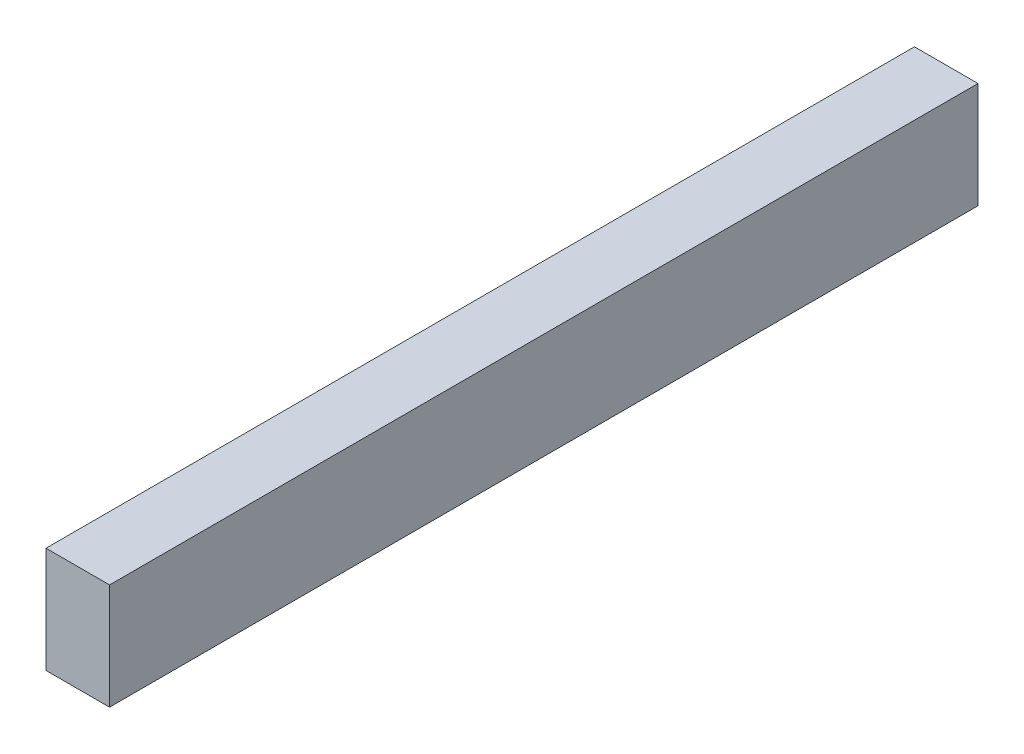
ISO-10303-21;
HEADER;
FILE_DESCRIPTION(('STEP AP214'),'2;1');
FILE_NAME('part.step','',(''),(''),'','','');
FILE_SCHEMA(('AUTOMOTIVE_DESIGN { 1 0 10303 214 1 1 1 1 }'));
ENDSEC;
DATA;
#1=APPLICATION_CONTEXT('core data for automotive mechanical design processes');
#2=APPLICATION_PROTOCOL_DEFINITION('international standard','automotive_design',2000,#1);
#3=PRODUCT_CONTEXT('',#1,'mechanical');
#4=PRODUCT('Part','Part','',(#3));
#5=PRODUCT_RELATED_PRODUCT_CATEGORY('part','',(#4));
#6=PRODUCT_DEFINITION_FORMATION('','',#4);
#7=PRODUCT_DEFINITION_CONTEXT('part definition',#1,'design');
#8=PRODUCT_DEFINITION('design','',#6,#7);
#9=PRODUCT_DEFINITION_SHAPE('','',#8);
#10=(LENGTH_UNIT() NAMED_UNIT(*) SI_UNIT(.MILLI.,.METRE.));
#11=(NAMED_UNIT(*) PLANE_ANGLE_UNIT() SI_UNIT($,.RADIAN.));
#12=(NAMED_UNIT(*) SI_UNIT($,.STERADIAN.) SOLID_ANGLE_UNIT());
#13=UNCERTAINTY_MEASURE_WITH_UNIT(LENGTH_MEASURE(1.E-05),#10,'distance_accuracy_value','');
#14=(GEOMETRIC_REPRESENTATION_CONTEXT(3) GLOBAL_UNCERTAINTY_ASSIGNED_CONTEXT((#13)) GLOBAL_UNIT_ASSIGNED_CONTEXT((#10,
#11,#12)) REPRESENTATION_CONTEXT('',''));
#15=CARTESIAN_POINT('',(0.,0.,0.));
#16=DIRECTION('',(0.,0.,1.));
#17=DIRECTION('',(1.,0.,0.));
#18=AXIS2_PLACEMENT_3D('',#15,#16,#17);
#19=CARTESIAN_POINT('',(0.,0.,410.));
#20=DIRECTION('',(1.,0.,0.));
#21=DIRECTION('',(0.,0.,-1.));
#22=AXIS2_PLACEMENT_3D('',#19,#20,#21);
#23=PLANE('',#22);
#24=DIRECTION('',(0.,-1.,0.));
#25=VECTOR('',#24,1.);
#26=CARTESIAN_POINT('',(0.,0.,0.));
#27=LINE('',#26,#25);
#28=CARTESIAN_POINT('',(0.,50.,0.));
#29=VERTEX_POINT('',#28);
#30=CARTESIAN_POINT('',(0.,0.,0.));
#31=VERTEX_POINT('',#30);
#32=EDGE_CURVE('E96',#29,#31,#27,.T.);
#33=ORIENTED_EDGE('',*,*,#32,.T.);
#34=DIRECTION('',(0.,0.,-1.));
#35=VECTOR('',#34,1.);
#36=CARTESIAN_POINT('',(0.,0.,410.));
#37=LINE('',#36,#35);
#38=CARTESIAN_POINT('',(0.,0.,410.));
#39=VERTEX_POINT('',#38);
#40=EDGE_CURVE('E11',#39,#31,#37,.T.);
#41=ORIENTED_EDGE('',*,*,#40,.F.);
#42=DIRECTION('',(0.,-1.,0.));
#43=VECTOR('',#42,1.);
#44=CARTESIAN_POINT('',(0.,0.,410.));
#45=LINE('',#44,#43);
#46=CARTESIAN_POINT('',(0.,50.,410.));
#47=VERTEX_POINT('',#46);
#48=EDGE_CURVE('E84',#47,#39,#45,.T.);
#49=ORIENTED_EDGE('',*,*,#48,.F.);
#50=DIRECTION('',(0.,0.,-1.));
#51=VECTOR('',#50,1.);
#52=CARTESIAN_POINT('',(0.,50.,410.));
#53=LINE('',#52,#51);
#54=EDGE_CURVE('E92',#47,#29,#53,.T.);
#55=ORIENTED_EDGE('',*,*,#54,.T.);
#56=EDGE_LOOP('',(#33,#41,#49,#55));
#57=FACE_BOUND('',#56,.T.);
#58=ADVANCED_FACE('F33',(#57),#23,.F.);
#59=CARTESIAN_POINT('',(0.,0.,410.));
#60=DIRECTION('',(0.,1.,0.));
#61=DIRECTION('',(0.,0.,1.));
#62=AXIS2_PLACEMENT_3D('',#59,#60,#61);
#63=PLANE('',#62);
#64=DIRECTION('',(1.,0.,0.));
#65=VECTOR('',#64,1.);
#66=CARTESIAN_POINT('',(0.,0.,0.));
#67=LINE('',#66,#65);
#68=CARTESIAN_POINT('',(30.,0.,0.));
#69=VERTEX_POINT('',#68);
#70=EDGE_CURVE('E88',#31,#69,#67,.T.);
#71=ORIENTED_EDGE('',*,*,#70,.T.);
#72=DIRECTION('',(0.,0.,-1.));
#73=VECTOR('',#72,1.);
#74=CARTESIAN_POINT('',(30.,0.,410.));
#75=LINE('',#74,#73);
#76=CARTESIAN_POINT('',(30.,0.,410.));
#77=VERTEX_POINT('',#76);
#78=EDGE_CURVE('E41',#77,#69,#75,.T.);
#79=ORIENTED_EDGE('',*,*,#78,.F.);
#80=DIRECTION('',(1.,0.,0.));
#81=VECTOR('',#80,1.);
#82=CARTESIAN_POINT('',(0.,0.,410.));
#83=LINE('',#82,#81);
#84=EDGE_CURVE('E79',#39,#77,#83,.T.);
#85=ORIENTED_EDGE('',*,*,#84,.F.);
#86=ORIENTED_EDGE('',*,*,#40,.T.);
#87=EDGE_LOOP('',(#71,#79,#85,#86));
#88=FACE_BOUND('',#87,.T.);
#89=ADVANCED_FACE('F87',(#88),#63,.F.);
#90=CARTESIAN_POINT('',(30.,0.,410.));
#91=DIRECTION('',(-1.,0.,0.));
#92=DIRECTION('',(0.,0.,1.));
#93=AXIS2_PLACEMENT_3D('',#90,#91,#92);
#94=PLANE('',#93);
#95=DIRECTION('',(0.,1.,0.));
#96=VECTOR('',#95,1.);
#97=CARTESIAN_POINT('',(30.,0.,0.));
#98=LINE('',#97,#96);
#99=CARTESIAN_POINT('',(30.,50.,0.));
#100=VERTEX_POINT('',#99);
#101=EDGE_CURVE('E66',#69,#100,#98,.T.);
#102=ORIENTED_EDGE('',*,*,#101,.T.);
#103=DIRECTION('',(0.,0.,-1.));
#104=VECTOR('',#103,1.);
#105=CARTESIAN_POINT('',(30.,50.,410.));
#106=LINE('',#105,#104);
#107=CARTESIAN_POINT('',(30.,50.,410.));
#108=VERTEX_POINT('',#107);
#109=EDGE_CURVE('E89',#108,#100,#106,.T.);
#110=ORIENTED_EDGE('',*,*,#109,.F.);
#111=DIRECTION('',(0.,1.,0.));
#112=VECTOR('',#111,1.);
#113=CARTESIAN_POINT('',(30.,0.,410.));
#114=LINE('',#113,#112);
#115=EDGE_CURVE('E82',#77,#108,#114,.T.);
#116=ORIENTED_EDGE('',*,*,#115,.F.);
#117=ORIENTED_EDGE('',*,*,#78,.T.);
#118=EDGE_LOOP('',(#102,#110,#116,#117));
#119=FACE_BOUND('',#118,.T.);
#120=ADVANCED_FACE('F90',(#119),#94,.F.);
#121=CARTESIAN_POINT('',(0.,50.,410.));
#122=DIRECTION('',(0.,-1.,0.));
#123=DIRECTION('',(0.,0.,-1.));
#124=AXIS2_PLACEMENT_3D('',#121,#122,#123);
#125=PLANE('',#124);
#126=DIRECTION('',(-1.,0.,0.));
#127=VECTOR('',#126,1.);
#128=CARTESIAN_POINT('',(0.,50.,0.));
#129=LINE('',#128,#127);
#130=EDGE_CURVE('E72',#100,#29,#129,.T.);
#131=ORIENTED_EDGE('',*,*,#130,.T.);
#132=ORIENTED_EDGE('',*,*,#54,.F.);
#133=DIRECTION('',(-1.,0.,0.));
#134=VECTOR('',#133,1.);
#135=CARTESIAN_POINT('',(0.,50.,410.));
#136=LINE('',#135,#134);
#137=EDGE_CURVE('E49',#108,#47,#136,.T.);
#138=ORIENTED_EDGE('',*,*,#137,.F.);
#139=ORIENTED_EDGE('',*,*,#109,.T.);
#140=EDGE_LOOP('',(#131,#132,#138,#139));
#141=FACE_BOUND('',#140,.T.);
#142=ADVANCED_FACE('F103',(#141),#125,.F.);
#143=CARTESIAN_POINT('',(0.,0.,410.));
#144=DIRECTION('',(0.,0.,-1.));
#145=DIRECTION('',(-1.,0.,0.));
#146=AXIS2_PLACEMENT_3D('',#143,#144,#145);
#147=PLANE('',#146);
#148=ORIENTED_EDGE('',*,*,#48,.T.);
#149=ORIENTED_EDGE('',*,*,#84,.T.);
#150=ORIENTED_EDGE('',*,*,#115,.T.);
#151=ORIENTED_EDGE('',*,*,#137,.T.);
#152=EDGE_LOOP('',(#148,#149,#150,#151));
#153=FACE_BOUND('',#152,.T.);
#154=ADVANCED_FACE('F80',(#153),#147,.F.);
#155=CARTESIAN_POINT('',(0.,0.,0.));
#156=DIRECTION('',(0.,0.,-1.));
#157=DIRECTION('',(-1.,0.,0.));
#158=AXIS2_PLACEMENT_3D('',#155,#156,#157);
#159=PLANE('',#158);
#160=ORIENTED_EDGE('',*,*,#32,.F.);
#161=ORIENTED_EDGE('',*,*,#130,.F.);
#162=ORIENTED_EDGE('',*,*,#101,.F.);
#163=ORIENTED_EDGE('',*,*,#70,.F.);
#164=EDGE_LOOP('',(#160,#161,#162,#163));
#165=FACE_BOUND('',#164,.T.);
#166=ADVANCED_FACE('F106',(#165),#159,.T.);
#167=CLOSED_SHELL('',(#58,#89,#120,#142,#154,#166));
#168=MANIFOLD_SOLID_BREP('B2',#167);
#169=ADVANCED_BREP_SHAPE_REPRESENTATION('',(#18,#168),#14);
#170=SHAPE_DEFINITION_REPRESENTATION(#9,#169);
ENDSEC;
END-ISO-10303-21;
